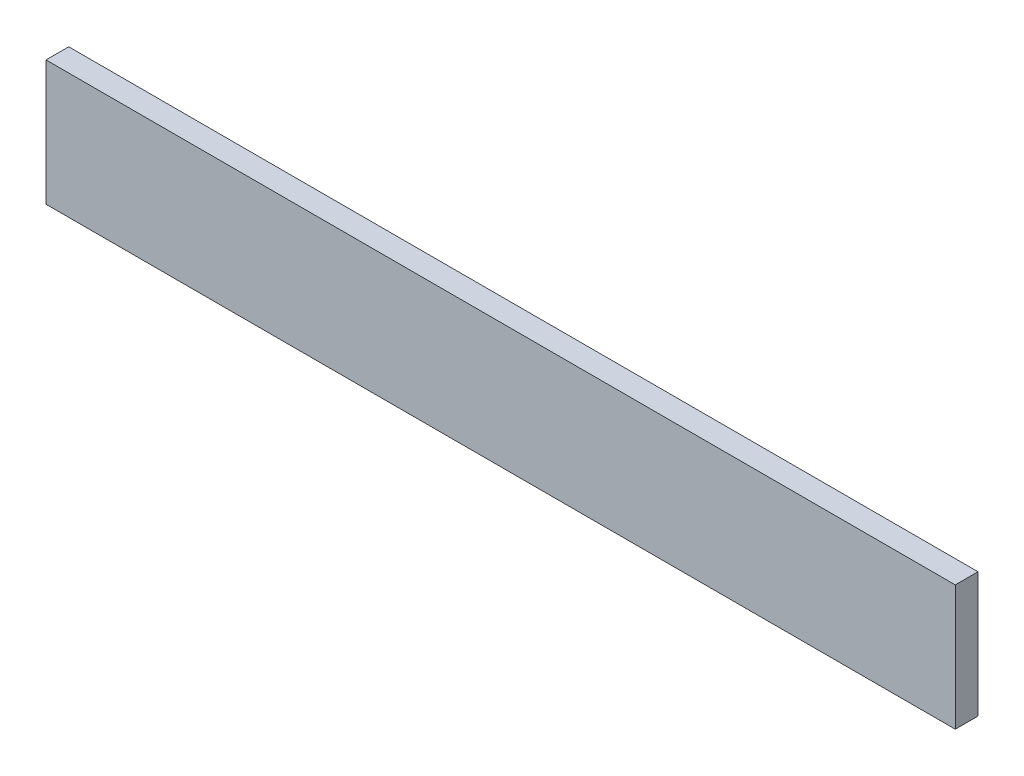
ISO-10303-21;
HEADER;
FILE_DESCRIPTION(('STEP AP214'),'2;1');
FILE_NAME('part.step','',(''),(''),'','','');
FILE_SCHEMA(('AUTOMOTIVE_DESIGN { 1 0 10303 214 1 1 1 1 }'));
ENDSEC;
DATA;
#1=APPLICATION_CONTEXT('core data for automotive mechanical design processes');
#2=APPLICATION_PROTOCOL_DEFINITION('international standard','automotive_design',2000,#1);
#3=PRODUCT_CONTEXT('',#1,'mechanical');
#4=PRODUCT('Part','Part','',(#3));
#5=PRODUCT_RELATED_PRODUCT_CATEGORY('part','',(#4));
#6=PRODUCT_DEFINITION_FORMATION('','',#4);
#7=PRODUCT_DEFINITION_CONTEXT('part definition',#1,'design');
#8=PRODUCT_DEFINITION('design','',#6,#7);
#9=PRODUCT_DEFINITION_SHAPE('','',#8);
#10=(LENGTH_UNIT() NAMED_UNIT(*) SI_UNIT(.MILLI.,.METRE.));
#11=(NAMED_UNIT(*) PLANE_ANGLE_UNIT() SI_UNIT($,.RADIAN.));
#12=(NAMED_UNIT(*) SI_UNIT($,.STERADIAN.) SOLID_ANGLE_UNIT());
#13=UNCERTAINTY_MEASURE_WITH_UNIT(LENGTH_MEASURE(1.E-05),#10,'distance_accuracy_value','');
#14=(GEOMETRIC_REPRESENTATION_CONTEXT(3) GLOBAL_UNCERTAINTY_ASSIGNED_CONTEXT((#13)) GLOBAL_UNIT_ASSIGNED_CONTEXT((#10,
#11,#12)) REPRESENTATION_CONTEXT('',''));
#15=CARTESIAN_POINT('',(0.,0.,0.));
#16=DIRECTION('',(0.,0.,1.));
#17=DIRECTION('',(1.,0.,0.));
#18=AXIS2_PLACEMENT_3D('',#15,#16,#17);
#19=CARTESIAN_POINT('',(0.,0.,2.));
#20=DIRECTION('',(1.,0.,0.));
#21=DIRECTION('',(0.,0.,-1.));
#22=AXIS2_PLACEMENT_3D('',#19,#20,#21);
#23=PLANE('',#22);
#24=DIRECTION('',(0.,-1.,0.));
#25=VECTOR('',#24,1.);
#26=CARTESIAN_POINT('',(0.,0.,0.));
#27=LINE('',#26,#25);
#28=CARTESIAN_POINT('',(0.,11.,0.));
#29=VERTEX_POINT('',#28);
#30=CARTESIAN_POINT('',(0.,0.,0.));
#31=VERTEX_POINT('',#30);
#32=EDGE_CURVE('E98',#29,#31,#27,.T.);
#33=ORIENTED_EDGE('',*,*,#32,.T.);
#34=DIRECTION('',(0.,0.,-1.));
#35=VECTOR('',#34,1.);
#36=CARTESIAN_POINT('',(0.,0.,2.));
#37=LINE('',#36,#35);
#38=CARTESIAN_POINT('',(0.,0.,2.));
#39=VERTEX_POINT('',#38);
#40=EDGE_CURVE('E11',#39,#31,#37,.T.);
#41=ORIENTED_EDGE('',*,*,#40,.F.);
#42=DIRECTION('',(0.,-1.,0.));
#43=VECTOR('',#42,1.);
#44=CARTESIAN_POINT('',(0.,0.,2.));
#45=LINE('',#44,#43);
#46=CARTESIAN_POINT('',(0.,11.,2.));
#47=VERTEX_POINT('',#46);
#48=EDGE_CURVE('E86',#47,#39,#45,.T.);
#49=ORIENTED_EDGE('',*,*,#48,.F.);
#50=DIRECTION('',(0.,0.,-1.));
#51=VECTOR('',#50,1.);
#52=CARTESIAN_POINT('',(0.,11.,2.));
#53=LINE('',#52,#51);
#54=EDGE_CURVE('E94',#47,#29,#53,.T.);
#55=ORIENTED_EDGE('',*,*,#54,.T.);
#56=EDGE_LOOP('',(#33,#41,#49,#55));
#57=FACE_BOUND('',#56,.T.);
#58=ADVANCED_FACE('F35',(#57),#23,.F.);
#59=CARTESIAN_POINT('',(0.,0.,2.));
#60=DIRECTION('',(0.,1.,0.));
#61=DIRECTION('',(0.,0.,1.));
#62=AXIS2_PLACEMENT_3D('',#59,#60,#61);
#63=PLANE('',#62);
#64=DIRECTION('',(1.,0.,0.));
#65=VECTOR('',#64,1.);
#66=CARTESIAN_POINT('',(0.,0.,0.));
#67=LINE('',#66,#65);
#68=CARTESIAN_POINT('',(80.,0.,0.));
#69=VERTEX_POINT('',#68);
#70=EDGE_CURVE('E90',#31,#69,#67,.T.);
#71=ORIENTED_EDGE('',*,*,#70,.T.);
#72=DIRECTION('',(0.,0.,-1.));
#73=VECTOR('',#72,1.);
#74=CARTESIAN_POINT('',(80.,0.,2.));
#75=LINE('',#74,#73);
#76=CARTESIAN_POINT('',(80.,0.,2.));
#77=VERTEX_POINT('',#76);
#78=EDGE_CURVE('E43',#77,#69,#75,.T.);
#79=ORIENTED_EDGE('',*,*,#78,.F.);
#80=DIRECTION('',(1.,0.,0.));
#81=VECTOR('',#80,1.);
#82=CARTESIAN_POINT('',(0.,0.,2.));
#83=LINE('',#82,#81);
#84=EDGE_CURVE('E81',#39,#77,#83,.T.);
#85=ORIENTED_EDGE('',*,*,#84,.F.);
#86=ORIENTED_EDGE('',*,*,#40,.T.);
#87=EDGE_LOOP('',(#71,#79,#85,#86));
#88=FACE_BOUND('',#87,.T.);
#89=ADVANCED_FACE('F89',(#88),#63,.F.);
#90=CARTESIAN_POINT('',(80.,0.,2.));
#91=DIRECTION('',(-1.,0.,0.));
#92=DIRECTION('',(0.,0.,1.));
#93=AXIS2_PLACEMENT_3D('',#90,#91,#92);
#94=PLANE('',#93);
#95=DIRECTION('',(0.,1.,0.));
#96=VECTOR('',#95,1.);
#97=CARTESIAN_POINT('',(80.,0.,0.));
#98=LINE('',#97,#96);
#99=CARTESIAN_POINT('',(80.,11.,0.));
#100=VERTEX_POINT('',#99);
#101=EDGE_CURVE('E68',#69,#100,#98,.T.);
#102=ORIENTED_EDGE('',*,*,#101,.T.);
#103=DIRECTION('',(0.,0.,-1.));
#104=VECTOR('',#103,1.);
#105=CARTESIAN_POINT('',(80.,11.,2.));
#106=LINE('',#105,#104);
#107=CARTESIAN_POINT('',(80.,11.,2.));
#108=VERTEX_POINT('',#107);
#109=EDGE_CURVE('E91',#108,#100,#106,.T.);
#110=ORIENTED_EDGE('',*,*,#109,.F.);
#111=DIRECTION('',(0.,1.,0.));
#112=VECTOR('',#111,1.);
#113=CARTESIAN_POINT('',(80.,0.,2.));
#114=LINE('',#113,#112);
#115=EDGE_CURVE('E84',#77,#108,#114,.T.);
#116=ORIENTED_EDGE('',*,*,#115,.F.);
#117=ORIENTED_EDGE('',*,*,#78,.T.);
#118=EDGE_LOOP('',(#102,#110,#116,#117));
#119=FACE_BOUND('',#118,.T.);
#120=ADVANCED_FACE('F92',(#119),#94,.F.);
#121=CARTESIAN_POINT('',(0.,11.,2.));
#122=DIRECTION('',(0.,-1.,0.));
#123=DIRECTION('',(0.,0.,-1.));
#124=AXIS2_PLACEMENT_3D('',#121,#122,#123);
#125=PLANE('',#124);
#126=DIRECTION('',(-1.,0.,0.));
#127=VECTOR('',#126,1.);
#128=CARTESIAN_POINT('',(0.,11.,0.));
#129=LINE('',#128,#127);
#130=EDGE_CURVE('E74',#100,#29,#129,.T.);
#131=ORIENTED_EDGE('',*,*,#130,.T.);
#132=ORIENTED_EDGE('',*,*,#54,.F.);
#133=DIRECTION('',(-1.,0.,0.));
#134=VECTOR('',#133,1.);
#135=CARTESIAN_POINT('',(0.,11.,2.));
#136=LINE('',#135,#134);
#137=EDGE_CURVE('E51',#108,#47,#136,.T.);
#138=ORIENTED_EDGE('',*,*,#137,.F.);
#139=ORIENTED_EDGE('',*,*,#109,.T.);
#140=EDGE_LOOP('',(#131,#132,#138,#139));
#141=FACE_BOUND('',#140,.T.);
#142=ADVANCED_FACE('F105',(#141),#125,.F.);
#143=CARTESIAN_POINT('',(0.,0.,2.));
#144=DIRECTION('',(0.,0.,-1.));
#145=DIRECTION('',(-1.,0.,0.));
#146=AXIS2_PLACEMENT_3D('',#143,#144,#145);
#147=PLANE('',#146);
#148=ORIENTED_EDGE('',*,*,#48,.T.);
#149=ORIENTED_EDGE('',*,*,#84,.T.);
#150=ORIENTED_EDGE('',*,*,#115,.T.);
#151=ORIENTED_EDGE('',*,*,#137,.T.);
#152=EDGE_LOOP('',(#148,#149,#150,#151));
#153=FACE_BOUND('',#152,.T.);
#154=ADVANCED_FACE('F82',(#153),#147,.F.);
#155=CARTESIAN_POINT('',(0.,0.,0.));
#156=DIRECTION('',(0.,0.,-1.));
#157=DIRECTION('',(-1.,0.,0.));
#158=AXIS2_PLACEMENT_3D('',#155,#156,#157);
#159=PLANE('',#158);
#160=ORIENTED_EDGE('',*,*,#32,.F.);
#161=ORIENTED_EDGE('',*,*,#130,.F.);
#162=ORIENTED_EDGE('',*,*,#101,.F.);
#163=ORIENTED_EDGE('',*,*,#70,.F.);
#164=EDGE_LOOP('',(#160,#161,#162,#163));
#165=FACE_BOUND('',#164,.T.);
#166=ADVANCED_FACE('F108',(#165),#159,.T.);
#167=CLOSED_SHELL('',(#58,#89,#120,#142,#154,#166));
#168=MANIFOLD_SOLID_BREP('B2',#167);
#169=ADVANCED_BREP_SHAPE_REPRESENTATION('',(#18,#168),#14);
#170=SHAPE_DEFINITION_REPRESENTATION(#9,#169);
ENDSEC;
END-ISO-10303-21;
